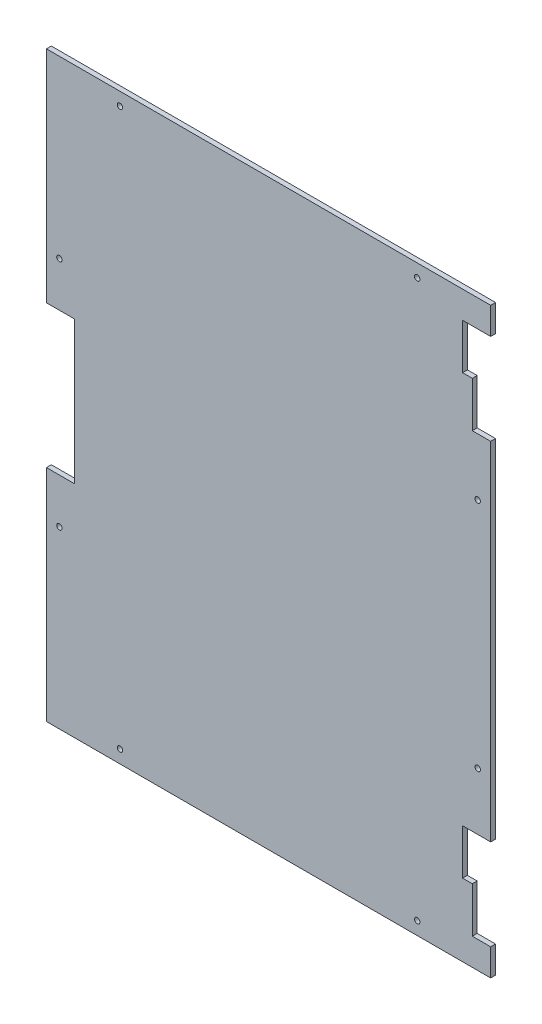
ISO-10303-21;
HEADER;
FILE_DESCRIPTION(('STEP AP214'),'2;1');
FILE_NAME('part.step','',(''),(''),'','','');
FILE_SCHEMA(('AUTOMOTIVE_DESIGN { 1 0 10303 214 1 1 1 1 }'));
ENDSEC;
DATA;
#1=APPLICATION_CONTEXT('core data for automotive mechanical design processes');
#2=APPLICATION_PROTOCOL_DEFINITION('international standard','automotive_design',2000,#1);
#3=PRODUCT_CONTEXT('',#1,'mechanical');
#4=PRODUCT('Part','Part','',(#3));
#5=PRODUCT_RELATED_PRODUCT_CATEGORY('part','',(#4));
#6=PRODUCT_DEFINITION_FORMATION('','',#4);
#7=PRODUCT_DEFINITION_CONTEXT('part definition',#1,'design');
#8=PRODUCT_DEFINITION('design','',#6,#7);
#9=PRODUCT_DEFINITION_SHAPE('','',#8);
#10=(LENGTH_UNIT() NAMED_UNIT(*) SI_UNIT(.MILLI.,.METRE.));
#11=(NAMED_UNIT(*) PLANE_ANGLE_UNIT() SI_UNIT($,.RADIAN.));
#12=(NAMED_UNIT(*) SI_UNIT($,.STERADIAN.) SOLID_ANGLE_UNIT());
#13=UNCERTAINTY_MEASURE_WITH_UNIT(LENGTH_MEASURE(1.E-05),#10,'distance_accuracy_value','');
#14=(GEOMETRIC_REPRESENTATION_CONTEXT(3) GLOBAL_UNCERTAINTY_ASSIGNED_CONTEXT((#13)) GLOBAL_UNIT_ASSIGNED_CONTEXT((#10,
#11,#12)) REPRESENTATION_CONTEXT('',''));
#15=CARTESIAN_POINT('',(0.,0.,0.));
#16=DIRECTION('',(0.,0.,1.));
#17=DIRECTION('',(1.,0.,0.));
#18=AXIS2_PLACEMENT_3D('',#15,#16,#17);
#19=CARTESIAN_POINT('',(0.,0.,4.5));
#20=DIRECTION('',(0.,0.,1.));
#21=DIRECTION('',(1.,0.,0.));
#22=AXIS2_PLACEMENT_3D('',#19,#20,#21);
#23=PLANE('',#22);
#24=CARTESIAN_POINT('',(192.5,107.5,4.5));
#25=DIRECTION('',(0.,0.,1.));
#26=DIRECTION('',(-1.,0.,0.));
#27=AXIS2_PLACEMENT_3D('',#24,#25,#26);
#28=CIRCLE('',#27,2.5);
#29=CARTESIAN_POINT('',(190.,107.5,4.5));
#30=VERTEX_POINT('',#29);
#31=EDGE_CURVE('E661',#30,#30,#28,.T.);
#32=ORIENTED_EDGE('',*,*,#31,.F.);
#33=EDGE_LOOP('',(#32));
#34=FACE_BOUND('',#33,.T.);
#35=CARTESIAN_POINT('',(-194.5,107.5,4.5));
#36=DIRECTION('',(0.,0.,1.));
#37=DIRECTION('',(1.,0.,0.));
#38=AXIS2_PLACEMENT_3D('',#35,#36,#37);
#39=CIRCLE('',#38,2.5);
#40=CARTESIAN_POINT('',(-192.,107.5,4.5));
#41=VERTEX_POINT('',#40);
#42=EDGE_CURVE('E673',#41,#41,#39,.T.);
#43=ORIENTED_EDGE('',*,*,#42,.F.);
#44=EDGE_LOOP('',(#43));
#45=FACE_BOUND('',#44,.T.);
#46=CARTESIAN_POINT('',(-138.5,257.5,4.5));
#47=DIRECTION('',(0.,0.,1.));
#48=DIRECTION('',(1.,0.,0.));
#49=AXIS2_PLACEMENT_3D('',#46,#47,#48);
#50=CIRCLE('',#49,2.5);
#51=CARTESIAN_POINT('',(-136.,257.5,4.5));
#52=VERTEX_POINT('',#51);
#53=EDGE_CURVE('E685',#52,#52,#50,.T.);
#54=ORIENTED_EDGE('',*,*,#53,.F.);
#55=EDGE_LOOP('',(#54));
#56=FACE_BOUND('',#55,.T.);
#57=CARTESIAN_POINT('',(136.5,-257.5,4.5));
#58=DIRECTION('',(0.,0.,1.));
#59=DIRECTION('',(1.,0.,0.));
#60=AXIS2_PLACEMENT_3D('',#57,#58,#59);
#61=CIRCLE('',#60,2.5);
#62=CARTESIAN_POINT('',(139.,-257.5,4.5));
#63=VERTEX_POINT('',#62);
#64=EDGE_CURVE('E208',#63,#63,#61,.T.);
#65=ORIENTED_EDGE('',*,*,#64,.F.);
#66=EDGE_LOOP('',(#65));
#67=FACE_BOUND('',#66,.T.);
#68=DIRECTION('',(0.,-1.,0.));
#69=VECTOR('',#68,1.);
#70=CARTESIAN_POINT('',(-206.5,269.5,4.5));
#71=LINE('',#70,#69);
#72=CARTESIAN_POINT('',(-206.5,269.5,4.5));
#73=VERTEX_POINT('',#72);
#74=CARTESIAN_POINT('',(-206.5,66.,4.5));
#75=VERTEX_POINT('',#74);
#76=EDGE_CURVE('E132',#73,#75,#71,.T.);
#77=ORIENTED_EDGE('',*,*,#76,.T.);
#78=DIRECTION('',(1.,0.,0.));
#79=VECTOR('',#78,1.);
#80=CARTESIAN_POINT('',(-206.5,66.,4.5));
#81=LINE('',#80,#79);
#82=CARTESIAN_POINT('',(-180.5,66.,4.5));
#83=VERTEX_POINT('',#82);
#84=EDGE_CURVE('E353',#75,#83,#81,.T.);
#85=ORIENTED_EDGE('',*,*,#84,.T.);
#86=DIRECTION('',(0.,-1.,0.));
#87=VECTOR('',#86,1.);
#88=CARTESIAN_POINT('',(-180.5,66.,4.5));
#89=LINE('',#88,#87);
#90=CARTESIAN_POINT('',(-180.5,-66.,4.5));
#91=VERTEX_POINT('',#90);
#92=EDGE_CURVE('E297',#83,#91,#89,.T.);
#93=ORIENTED_EDGE('',*,*,#92,.T.);
#94=DIRECTION('',(-1.,0.,0.));
#95=VECTOR('',#94,1.);
#96=CARTESIAN_POINT('',(-206.5,-66.,4.5));
#97=LINE('',#96,#95);
#98=CARTESIAN_POINT('',(-206.5,-66.,4.5));
#99=VERTEX_POINT('',#98);
#100=EDGE_CURVE('E315',#91,#99,#97,.T.);
#101=ORIENTED_EDGE('',*,*,#100,.T.);
#102=DIRECTION('',(0.,-1.,0.));
#103=VECTOR('',#102,1.);
#104=CARTESIAN_POINT('',(-206.5,-66.,4.5));
#105=LINE('',#104,#103);
#106=CARTESIAN_POINT('',(-206.5,-269.5,4.5));
#107=VERTEX_POINT('',#106);
#108=EDGE_CURVE('E312',#99,#107,#105,.T.);
#109=ORIENTED_EDGE('',*,*,#108,.T.);
#110=DIRECTION('',(1.,0.,0.));
#111=VECTOR('',#110,1.);
#112=CARTESIAN_POINT('',(-206.5,-269.5,4.5));
#113=LINE('',#112,#111);
#114=CARTESIAN_POINT('',(204.5,-269.5,4.5));
#115=VERTEX_POINT('',#114);
#116=EDGE_CURVE('E314',#107,#115,#113,.T.);
#117=ORIENTED_EDGE('',*,*,#116,.T.);
#118=DIRECTION('',(0.,1.,0.));
#119=VECTOR('',#118,1.);
#120=CARTESIAN_POINT('',(204.5,-244.5,4.5));
#121=LINE('',#120,#119);
#122=CARTESIAN_POINT('',(204.5,-244.5,4.5));
#123=VERTEX_POINT('',#122);
#124=EDGE_CURVE('E317',#115,#123,#121,.T.);
#125=ORIENTED_EDGE('',*,*,#124,.T.);
#126=DIRECTION('',(-1.,0.,0.));
#127=VECTOR('',#126,1.);
#128=CARTESIAN_POINT('',(187.5,-244.5,4.5));
#129=LINE('',#128,#127);
#130=CARTESIAN_POINT('',(187.5,-244.5,4.5));
#131=VERTEX_POINT('',#130);
#132=EDGE_CURVE('E323',#123,#131,#129,.T.);
#133=ORIENTED_EDGE('',*,*,#132,.T.);
#134=DIRECTION('',(0.,1.,0.));
#135=VECTOR('',#134,1.);
#136=CARTESIAN_POINT('',(187.5,-202.5,4.5));
#137=LINE('',#136,#135);
#138=CARTESIAN_POINT('',(187.5,-202.5,4.5));
#139=VERTEX_POINT('',#138);
#140=EDGE_CURVE('E325',#131,#139,#137,.T.);
#141=ORIENTED_EDGE('',*,*,#140,.T.);
#142=DIRECTION('',(-1.,0.,0.));
#143=VECTOR('',#142,1.);
#144=CARTESIAN_POINT('',(178.5,-202.5,4.5));
#145=LINE('',#144,#143);
#146=CARTESIAN_POINT('',(178.5,-202.5,4.5));
#147=VERTEX_POINT('',#146);
#148=EDGE_CURVE('E327',#139,#147,#145,.T.);
#149=ORIENTED_EDGE('',*,*,#148,.T.);
#150=DIRECTION('',(0.,1.,0.));
#151=VECTOR('',#150,1.);
#152=CARTESIAN_POINT('',(178.5,-160.5,4.5));
#153=LINE('',#152,#151);
#154=CARTESIAN_POINT('',(178.5,-160.5,4.5));
#155=VERTEX_POINT('',#154);
#156=EDGE_CURVE('E329',#147,#155,#153,.T.);
#157=ORIENTED_EDGE('',*,*,#156,.T.);
#158=DIRECTION('',(1.,0.,0.));
#159=VECTOR('',#158,1.);
#160=CARTESIAN_POINT('',(204.5,-160.5,4.5));
#161=LINE('',#160,#159);
#162=CARTESIAN_POINT('',(204.5,-160.5,4.5));
#163=VERTEX_POINT('',#162);
#164=EDGE_CURVE('E331',#155,#163,#161,.T.);
#165=ORIENTED_EDGE('',*,*,#164,.T.);
#166=DIRECTION('',(0.,1.,0.));
#167=VECTOR('',#166,1.);
#168=CARTESIAN_POINT('',(204.5,160.5,4.5));
#169=LINE('',#168,#167);
#170=CARTESIAN_POINT('',(204.5,160.5,4.5));
#171=VERTEX_POINT('',#170);
#172=EDGE_CURVE('E333',#163,#171,#169,.T.);
#173=ORIENTED_EDGE('',*,*,#172,.T.);
#174=DIRECTION('',(-1.,0.,0.));
#175=VECTOR('',#174,1.);
#176=CARTESIAN_POINT('',(204.5,160.5,4.5));
#177=LINE('',#176,#175);
#178=CARTESIAN_POINT('',(187.5,160.5,4.5));
#179=VERTEX_POINT('',#178);
#180=EDGE_CURVE('E335',#171,#179,#177,.T.);
#181=ORIENTED_EDGE('',*,*,#180,.T.);
#182=DIRECTION('',(0.,1.,0.));
#183=VECTOR('',#182,1.);
#184=CARTESIAN_POINT('',(187.5,202.5,4.5));
#185=LINE('',#184,#183);
#186=CARTESIAN_POINT('',(187.5,202.5,4.5));
#187=VERTEX_POINT('',#186);
#188=EDGE_CURVE('E337',#179,#187,#185,.T.);
#189=ORIENTED_EDGE('',*,*,#188,.T.);
#190=DIRECTION('',(-1.,0.,0.));
#191=VECTOR('',#190,1.);
#192=CARTESIAN_POINT('',(178.5,202.5,4.5));
#193=LINE('',#192,#191);
#194=CARTESIAN_POINT('',(178.5,202.5,4.5));
#195=VERTEX_POINT('',#194);
#196=EDGE_CURVE('E339',#187,#195,#193,.T.);
#197=ORIENTED_EDGE('',*,*,#196,.T.);
#198=DIRECTION('',(0.,1.,0.));
#199=VECTOR('',#198,1.);
#200=CARTESIAN_POINT('',(178.5,202.5,4.5));
#201=LINE('',#200,#199);
#202=CARTESIAN_POINT('',(178.5,244.5,4.5));
#203=VERTEX_POINT('',#202);
#204=EDGE_CURVE('E188',#195,#203,#201,.T.);
#205=ORIENTED_EDGE('',*,*,#204,.T.);
#206=DIRECTION('',(1.,0.,0.));
#207=VECTOR('',#206,1.);
#208=CARTESIAN_POINT('',(204.5,244.5,4.5));
#209=LINE('',#208,#207);
#210=CARTESIAN_POINT('',(204.5,244.5,4.5));
#211=VERTEX_POINT('',#210);
#212=EDGE_CURVE('E182',#203,#211,#209,.T.);
#213=ORIENTED_EDGE('',*,*,#212,.T.);
#214=DIRECTION('',(0.,1.,0.));
#215=VECTOR('',#214,1.);
#216=CARTESIAN_POINT('',(204.5,269.5,4.5));
#217=LINE('',#216,#215);
#218=CARTESIAN_POINT('',(204.5,269.5,4.5));
#219=VERTEX_POINT('',#218);
#220=EDGE_CURVE('E186',#211,#219,#217,.T.);
#221=ORIENTED_EDGE('',*,*,#220,.T.);
#222=DIRECTION('',(-1.,0.,0.));
#223=VECTOR('',#222,1.);
#224=CARTESIAN_POINT('',(-206.5,269.5,4.5));
#225=LINE('',#224,#223);
#226=EDGE_CURVE('E54',#219,#73,#225,.T.);
#227=ORIENTED_EDGE('',*,*,#226,.T.);
#228=EDGE_LOOP('',(#77,#85,#93,#101,#109,#117,#125,#133,#141,#149,#157,#165,#173,#181,#189,#197,
#205,#213,#221,#227));
#229=FACE_BOUND('',#228,.T.);
#230=CARTESIAN_POINT('',(-138.5,-257.5,4.5));
#231=DIRECTION('',(0.,0.,1.));
#232=DIRECTION('',(-1.,0.,0.));
#233=AXIS2_PLACEMENT_3D('',#230,#231,#232);
#234=CIRCLE('',#233,2.5);
#235=CARTESIAN_POINT('',(-141.,-257.5,4.5));
#236=VERTEX_POINT('',#235);
#237=EDGE_CURVE('E691',#236,#236,#234,.T.);
#238=ORIENTED_EDGE('',*,*,#237,.F.);
#239=EDGE_LOOP('',(#238));
#240=FACE_BOUND('',#239,.T.);
#241=CARTESIAN_POINT('',(136.5,257.5,4.5));
#242=DIRECTION('',(0.,0.,1.));
#243=DIRECTION('',(-1.,0.,0.));
#244=AXIS2_PLACEMENT_3D('',#241,#242,#243);
#245=CIRCLE('',#244,2.5);
#246=CARTESIAN_POINT('',(134.,257.5,4.5));
#247=VERTEX_POINT('',#246);
#248=EDGE_CURVE('E679',#247,#247,#245,.T.);
#249=ORIENTED_EDGE('',*,*,#248,.F.);
#250=EDGE_LOOP('',(#249));
#251=FACE_BOUND('',#250,.T.);
#252=CARTESIAN_POINT('',(-194.5,-107.5,4.5));
#253=DIRECTION('',(0.,0.,1.));
#254=DIRECTION('',(-1.,0.,0.));
#255=AXIS2_PLACEMENT_3D('',#252,#253,#254);
#256=CIRCLE('',#255,2.49999999999997);
#257=CARTESIAN_POINT('',(-197.,-107.5,4.5));
#258=VERTEX_POINT('',#257);
#259=EDGE_CURVE('E667',#258,#258,#256,.T.);
#260=ORIENTED_EDGE('',*,*,#259,.F.);
#261=EDGE_LOOP('',(#260));
#262=FACE_BOUND('',#261,.T.);
#263=CARTESIAN_POINT('',(192.5,-107.5,4.5));
#264=DIRECTION('',(0.,0.,1.));
#265=DIRECTION('',(1.,0.,0.));
#266=AXIS2_PLACEMENT_3D('',#263,#264,#265);
#267=CIRCLE('',#266,2.49999999999997);
#268=CARTESIAN_POINT('',(195.,-107.5,4.5));
#269=VERTEX_POINT('',#268);
#270=EDGE_CURVE('E652',#269,#269,#267,.T.);
#271=ORIENTED_EDGE('',*,*,#270,.F.);
#272=EDGE_LOOP('',(#271));
#273=FACE_BOUND('',#272,.T.);
#274=ADVANCED_FACE('F37',(#34,#45,#56,#67,#229,#240,#251,#262,#273),#23,.T.);
#275=CARTESIAN_POINT('',(0.,0.,0.));
#276=DIRECTION('',(0.,0.,1.));
#277=DIRECTION('',(1.,0.,0.));
#278=AXIS2_PLACEMENT_3D('',#275,#276,#277);
#279=PLANE('',#278);
#280=DIRECTION('',(0.,-1.,0.));
#281=VECTOR('',#280,1.);
#282=CARTESIAN_POINT('',(-206.5,160.5,0.));
#283=LINE('',#282,#281);
#284=CARTESIAN_POINT('',(-206.5,269.5,0.));
#285=VERTEX_POINT('',#284);
#286=CARTESIAN_POINT('',(-206.5,66.,0.));
#287=VERTEX_POINT('',#286);
#288=EDGE_CURVE('E126',#285,#287,#283,.T.);
#289=ORIENTED_EDGE('',*,*,#288,.F.);
#290=DIRECTION('',(-1.,0.,0.));
#291=VECTOR('',#290,1.);
#292=CARTESIAN_POINT('',(-206.5,269.5,0.));
#293=LINE('',#292,#291);
#294=CARTESIAN_POINT('',(204.5,269.5,0.));
#295=VERTEX_POINT('',#294);
#296=EDGE_CURVE('E243',#295,#285,#293,.T.);
#297=ORIENTED_EDGE('',*,*,#296,.F.);
#298=DIRECTION('',(0.,1.,0.));
#299=VECTOR('',#298,1.);
#300=CARTESIAN_POINT('',(204.5,269.5,0.));
#301=LINE('',#300,#299);
#302=CARTESIAN_POINT('',(204.5,244.5,0.));
#303=VERTEX_POINT('',#302);
#304=EDGE_CURVE('E119',#303,#295,#301,.T.);
#305=ORIENTED_EDGE('',*,*,#304,.F.);
#306=DIRECTION('',(1.,0.,0.));
#307=VECTOR('',#306,1.);
#308=CARTESIAN_POINT('',(204.5,244.5,0.));
#309=LINE('',#308,#307);
#310=CARTESIAN_POINT('',(178.5,244.5,0.));
#311=VERTEX_POINT('',#310);
#312=EDGE_CURVE('E196',#311,#303,#309,.T.);
#313=ORIENTED_EDGE('',*,*,#312,.F.);
#314=DIRECTION('',(0.,1.,0.));
#315=VECTOR('',#314,1.);
#316=CARTESIAN_POINT('',(178.5,202.5,0.));
#317=LINE('',#316,#315);
#318=CARTESIAN_POINT('',(178.5,202.5,0.));
#319=VERTEX_POINT('',#318);
#320=EDGE_CURVE('E239',#319,#311,#317,.T.);
#321=ORIENTED_EDGE('',*,*,#320,.F.);
#322=DIRECTION('',(-1.,0.,0.));
#323=VECTOR('',#322,1.);
#324=CARTESIAN_POINT('',(178.5,202.5,0.));
#325=LINE('',#324,#323);
#326=CARTESIAN_POINT('',(187.5,202.5,0.));
#327=VERTEX_POINT('',#326);
#328=EDGE_CURVE('E237',#327,#319,#325,.T.);
#329=ORIENTED_EDGE('',*,*,#328,.F.);
#330=DIRECTION('',(0.,1.,0.));
#331=VECTOR('',#330,1.);
#332=CARTESIAN_POINT('',(187.5,202.5,0.));
#333=LINE('',#332,#331);
#334=CARTESIAN_POINT('',(187.5,160.5,0.));
#335=VERTEX_POINT('',#334);
#336=EDGE_CURVE('E235',#335,#327,#333,.T.);
#337=ORIENTED_EDGE('',*,*,#336,.F.);
#338=DIRECTION('',(-1.,0.,0.));
#339=VECTOR('',#338,1.);
#340=CARTESIAN_POINT('',(204.5,160.5,0.));
#341=LINE('',#340,#339);
#342=CARTESIAN_POINT('',(204.5,160.5,0.));
#343=VERTEX_POINT('',#342);
#344=EDGE_CURVE('E233',#343,#335,#341,.T.);
#345=ORIENTED_EDGE('',*,*,#344,.F.);
#346=DIRECTION('',(0.,1.,0.));
#347=VECTOR('',#346,1.);
#348=CARTESIAN_POINT('',(204.5,160.5,0.));
#349=LINE('',#348,#347);
#350=CARTESIAN_POINT('',(204.5,-160.5,0.));
#351=VERTEX_POINT('',#350);
#352=EDGE_CURVE('E231',#351,#343,#349,.T.);
#353=ORIENTED_EDGE('',*,*,#352,.F.);
#354=DIRECTION('',(1.,0.,0.));
#355=VECTOR('',#354,1.);
#356=CARTESIAN_POINT('',(204.5,-160.5,0.));
#357=LINE('',#356,#355);
#358=CARTESIAN_POINT('',(178.5,-160.5,0.));
#359=VERTEX_POINT('',#358);
#360=EDGE_CURVE('E229',#359,#351,#357,.T.);
#361=ORIENTED_EDGE('',*,*,#360,.F.);
#362=DIRECTION('',(0.,1.,0.));
#363=VECTOR('',#362,1.);
#364=CARTESIAN_POINT('',(178.5,-160.5,0.));
#365=LINE('',#364,#363);
#366=CARTESIAN_POINT('',(178.5,-202.5,0.));
#367=VERTEX_POINT('',#366);
#368=EDGE_CURVE('E227',#367,#359,#365,.T.);
#369=ORIENTED_EDGE('',*,*,#368,.F.);
#370=DIRECTION('',(-1.,0.,0.));
#371=VECTOR('',#370,1.);
#372=CARTESIAN_POINT('',(178.5,-202.5,0.));
#373=LINE('',#372,#371);
#374=CARTESIAN_POINT('',(187.5,-202.5,0.));
#375=VERTEX_POINT('',#374);
#376=EDGE_CURVE('E225',#375,#367,#373,.T.);
#377=ORIENTED_EDGE('',*,*,#376,.F.);
#378=DIRECTION('',(0.,1.,0.));
#379=VECTOR('',#378,1.);
#380=CARTESIAN_POINT('',(187.5,-202.5,0.));
#381=LINE('',#380,#379);
#382=CARTESIAN_POINT('',(187.5,-244.5,0.));
#383=VERTEX_POINT('',#382);
#384=EDGE_CURVE('E223',#383,#375,#381,.T.);
#385=ORIENTED_EDGE('',*,*,#384,.F.);
#386=DIRECTION('',(-1.,0.,0.));
#387=VECTOR('',#386,1.);
#388=CARTESIAN_POINT('',(187.5,-244.5,0.));
#389=LINE('',#388,#387);
#390=CARTESIAN_POINT('',(204.5,-244.5,0.));
#391=VERTEX_POINT('',#390);
#392=EDGE_CURVE('E221',#391,#383,#389,.T.);
#393=ORIENTED_EDGE('',*,*,#392,.F.);
#394=DIRECTION('',(0.,1.,0.));
#395=VECTOR('',#394,1.);
#396=CARTESIAN_POINT('',(204.5,-244.5,0.));
#397=LINE('',#396,#395);
#398=CARTESIAN_POINT('',(204.5,-269.5,0.));
#399=VERTEX_POINT('',#398);
#400=EDGE_CURVE('E219',#399,#391,#397,.T.);
#401=ORIENTED_EDGE('',*,*,#400,.F.);
#402=DIRECTION('',(1.,0.,0.));
#403=VECTOR('',#402,1.);
#404=CARTESIAN_POINT('',(-206.5,-269.5,0.));
#405=LINE('',#404,#403);
#406=CARTESIAN_POINT('',(-206.5,-269.5,0.));
#407=VERTEX_POINT('',#406);
#408=EDGE_CURVE('E217',#407,#399,#405,.T.);
#409=ORIENTED_EDGE('',*,*,#408,.F.);
#410=DIRECTION('',(0.,-1.,0.));
#411=VECTOR('',#410,1.);
#412=CARTESIAN_POINT('',(-206.5,-244.5,0.));
#413=LINE('',#412,#411);
#414=CARTESIAN_POINT('',(-206.5,-66.,0.));
#415=VERTEX_POINT('',#414);
#416=EDGE_CURVE('E215',#415,#407,#413,.T.);
#417=ORIENTED_EDGE('',*,*,#416,.F.);
#418=DIRECTION('',(-1.,0.,0.));
#419=VECTOR('',#418,1.);
#420=CARTESIAN_POINT('',(-206.5,-66.,0.));
#421=LINE('',#420,#419);
#422=CARTESIAN_POINT('',(-180.5,-66.,0.));
#423=VERTEX_POINT('',#422);
#424=EDGE_CURVE('E212',#423,#415,#421,.T.);
#425=ORIENTED_EDGE('',*,*,#424,.F.);
#426=DIRECTION('',(0.,-1.,0.));
#427=VECTOR('',#426,1.);
#428=CARTESIAN_POINT('',(-180.5,66.,0.));
#429=LINE('',#428,#427);
#430=CARTESIAN_POINT('',(-180.5,66.,0.));
#431=VERTEX_POINT('',#430);
#432=EDGE_CURVE('E210',#431,#423,#429,.T.);
#433=ORIENTED_EDGE('',*,*,#432,.F.);
#434=DIRECTION('',(1.,0.,0.));
#435=VECTOR('',#434,1.);
#436=CARTESIAN_POINT('',(-206.5,66.,0.));
#437=LINE('',#436,#435);
#438=EDGE_CURVE('E207',#287,#431,#437,.T.);
#439=ORIENTED_EDGE('',*,*,#438,.F.);
#440=EDGE_LOOP('',(#289,#297,#305,#313,#321,#329,#337,#345,#353,#361,#369,#377,#385,#393,#401,
#409,#417,#425,#433,#439));
#441=FACE_BOUND('',#440,.T.);
#442=CARTESIAN_POINT('',(136.5,-257.5,0.));
#443=DIRECTION('',(0.,0.,1.));
#444=DIRECTION('',(1.,0.,0.));
#445=AXIS2_PLACEMENT_3D('',#442,#443,#444);
#446=CIRCLE('',#445,2.5);
#447=CARTESIAN_POINT('',(139.,-257.5,0.));
#448=VERTEX_POINT('',#447);
#449=EDGE_CURVE('E357',#448,#448,#446,.T.);
#450=ORIENTED_EDGE('',*,*,#449,.T.);
#451=EDGE_LOOP('',(#450));
#452=FACE_BOUND('',#451,.T.);
#453=CARTESIAN_POINT('',(-138.5,-257.5,0.));
#454=DIRECTION('',(0.,0.,1.));
#455=DIRECTION('',(-1.,0.,0.));
#456=AXIS2_PLACEMENT_3D('',#453,#454,#455);
#457=CIRCLE('',#456,2.5);
#458=CARTESIAN_POINT('',(-141.,-257.5,0.));
#459=VERTEX_POINT('',#458);
#460=EDGE_CURVE('E688',#459,#459,#457,.T.);
#461=ORIENTED_EDGE('',*,*,#460,.T.);
#462=EDGE_LOOP('',(#461));
#463=FACE_BOUND('',#462,.T.);
#464=CARTESIAN_POINT('',(-138.5,257.5,0.));
#465=DIRECTION('',(0.,0.,1.));
#466=DIRECTION('',(1.,0.,0.));
#467=AXIS2_PLACEMENT_3D('',#464,#465,#466);
#468=CIRCLE('',#467,2.5);
#469=CARTESIAN_POINT('',(-136.,257.5,0.));
#470=VERTEX_POINT('',#469);
#471=EDGE_CURVE('E682',#470,#470,#468,.T.);
#472=ORIENTED_EDGE('',*,*,#471,.T.);
#473=EDGE_LOOP('',(#472));
#474=FACE_BOUND('',#473,.T.);
#475=CARTESIAN_POINT('',(136.5,257.5,0.));
#476=DIRECTION('',(0.,0.,1.));
#477=DIRECTION('',(-1.,0.,0.));
#478=AXIS2_PLACEMENT_3D('',#475,#476,#477);
#479=CIRCLE('',#478,2.5);
#480=CARTESIAN_POINT('',(134.,257.5,0.));
#481=VERTEX_POINT('',#480);
#482=EDGE_CURVE('E676',#481,#481,#479,.T.);
#483=ORIENTED_EDGE('',*,*,#482,.T.);
#484=EDGE_LOOP('',(#483));
#485=FACE_BOUND('',#484,.T.);
#486=CARTESIAN_POINT('',(-194.5,107.5,0.));
#487=DIRECTION('',(0.,0.,1.));
#488=DIRECTION('',(1.,0.,0.));
#489=AXIS2_PLACEMENT_3D('',#486,#487,#488);
#490=CIRCLE('',#489,2.5);
#491=CARTESIAN_POINT('',(-192.,107.5,0.));
#492=VERTEX_POINT('',#491);
#493=EDGE_CURVE('E670',#492,#492,#490,.T.);
#494=ORIENTED_EDGE('',*,*,#493,.T.);
#495=EDGE_LOOP('',(#494));
#496=FACE_BOUND('',#495,.T.);
#497=CARTESIAN_POINT('',(-194.5,-107.5,0.));
#498=DIRECTION('',(0.,0.,1.));
#499=DIRECTION('',(-1.,0.,0.));
#500=AXIS2_PLACEMENT_3D('',#497,#498,#499);
#501=CIRCLE('',#500,2.49999999999997);
#502=CARTESIAN_POINT('',(-197.,-107.5,0.));
#503=VERTEX_POINT('',#502);
#504=EDGE_CURVE('E664',#503,#503,#501,.T.);
#505=ORIENTED_EDGE('',*,*,#504,.T.);
#506=EDGE_LOOP('',(#505));
#507=FACE_BOUND('',#506,.T.);
#508=CARTESIAN_POINT('',(192.5,107.5,0.));
#509=DIRECTION('',(0.,0.,1.));
#510=DIRECTION('',(-1.,0.,0.));
#511=AXIS2_PLACEMENT_3D('',#508,#509,#510);
#512=CIRCLE('',#511,2.5);
#513=CARTESIAN_POINT('',(190.,107.5,0.));
#514=VERTEX_POINT('',#513);
#515=EDGE_CURVE('E658',#514,#514,#512,.T.);
#516=ORIENTED_EDGE('',*,*,#515,.T.);
#517=EDGE_LOOP('',(#516));
#518=FACE_BOUND('',#517,.T.);
#519=CARTESIAN_POINT('',(192.5,-107.5,0.));
#520=DIRECTION('',(0.,0.,1.));
#521=DIRECTION('',(1.,0.,0.));
#522=AXIS2_PLACEMENT_3D('',#519,#520,#521);
#523=CIRCLE('',#522,2.49999999999997);
#524=CARTESIAN_POINT('',(195.,-107.5,0.));
#525=VERTEX_POINT('',#524);
#526=EDGE_CURVE('E655',#525,#525,#523,.T.);
#527=ORIENTED_EDGE('',*,*,#526,.T.);
#528=EDGE_LOOP('',(#527));
#529=FACE_BOUND('',#528,.T.);
#530=ADVANCED_FACE('F301',(#441,#452,#463,#474,#485,#496,#507,#518,#529),#279,.F.);
#531=CARTESIAN_POINT('',(-206.5,160.5,4.5));
#532=DIRECTION('',(1.,0.,0.));
#533=DIRECTION('',(0.,1.,0.));
#534=AXIS2_PLACEMENT_3D('',#531,#532,#533);
#535=PLANE('',#534);
#536=ORIENTED_EDGE('',*,*,#288,.T.);
#537=DIRECTION('',(0.,0.,-1.));
#538=VECTOR('',#537,1.);
#539=CARTESIAN_POINT('',(-206.5,66.,4.5));
#540=LINE('',#539,#538);
#541=EDGE_CURVE('E11',#75,#287,#540,.T.);
#542=ORIENTED_EDGE('',*,*,#541,.F.);
#543=ORIENTED_EDGE('',*,*,#76,.F.);
#544=DIRECTION('',(0.,0.,-1.));
#545=VECTOR('',#544,1.);
#546=CARTESIAN_POINT('',(-206.5,269.5,4.5));
#547=LINE('',#546,#545);
#548=EDGE_CURVE('E202',#73,#285,#547,.T.);
#549=ORIENTED_EDGE('',*,*,#548,.T.);
#550=EDGE_LOOP('',(#536,#542,#543,#549));
#551=FACE_BOUND('',#550,.T.);
#552=ADVANCED_FACE('F39',(#551),#535,.F.);
#553=CARTESIAN_POINT('',(-206.5,66.,4.5));
#554=DIRECTION('',(0.,1.,0.));
#555=DIRECTION('',(0.,0.,1.));
#556=AXIS2_PLACEMENT_3D('',#553,#554,#555);
#557=PLANE('',#556);
#558=ORIENTED_EDGE('',*,*,#438,.T.);
#559=DIRECTION('',(0.,0.,-1.));
#560=VECTOR('',#559,1.);
#561=CARTESIAN_POINT('',(-180.5,66.,4.5));
#562=LINE('',#561,#560);
#563=EDGE_CURVE('E46',#83,#431,#562,.T.);
#564=ORIENTED_EDGE('',*,*,#563,.F.);
#565=ORIENTED_EDGE('',*,*,#84,.F.);
#566=ORIENTED_EDGE('',*,*,#541,.T.);
#567=EDGE_LOOP('',(#558,#564,#565,#566));
#568=FACE_BOUND('',#567,.T.);
#569=ADVANCED_FACE('F359',(#568),#557,.F.);
#570=CARTESIAN_POINT('',(-180.5,66.,4.5));
#571=DIRECTION('',(1.,0.,0.));
#572=DIRECTION('',(0.,1.,0.));
#573=AXIS2_PLACEMENT_3D('',#570,#571,#572);
#574=PLANE('',#573);
#575=ORIENTED_EDGE('',*,*,#432,.T.);
#576=DIRECTION('',(0.,0.,-1.));
#577=VECTOR('',#576,1.);
#578=CARTESIAN_POINT('',(-180.5,-66.,4.5));
#579=LINE('',#578,#577);
#580=EDGE_CURVE('E288',#91,#423,#579,.T.);
#581=ORIENTED_EDGE('',*,*,#580,.F.);
#582=ORIENTED_EDGE('',*,*,#92,.F.);
#583=ORIENTED_EDGE('',*,*,#563,.T.);
#584=EDGE_LOOP('',(#575,#581,#582,#583));
#585=FACE_BOUND('',#584,.T.);
#586=ADVANCED_FACE('F295',(#585),#574,.F.);
#587=CARTESIAN_POINT('',(-206.5,-66.,4.5));
#588=DIRECTION('',(0.,-1.,0.));
#589=DIRECTION('',(0.,0.,-1.));
#590=AXIS2_PLACEMENT_3D('',#587,#588,#589);
#591=PLANE('',#590);
#592=ORIENTED_EDGE('',*,*,#424,.T.);
#593=DIRECTION('',(0.,0.,-1.));
#594=VECTOR('',#593,1.);
#595=CARTESIAN_POINT('',(-206.5,-66.,4.5));
#596=LINE('',#595,#594);
#597=EDGE_CURVE('E285',#99,#415,#596,.T.);
#598=ORIENTED_EDGE('',*,*,#597,.F.);
#599=ORIENTED_EDGE('',*,*,#100,.F.);
#600=ORIENTED_EDGE('',*,*,#580,.T.);
#601=EDGE_LOOP('',(#592,#598,#599,#600));
#602=FACE_BOUND('',#601,.T.);
#603=ADVANCED_FACE('F306',(#602),#591,.F.);
#604=CARTESIAN_POINT('',(-206.5,-244.5,4.5));
#605=DIRECTION('',(1.,0.,0.));
#606=DIRECTION('',(0.,1.,0.));
#607=AXIS2_PLACEMENT_3D('',#604,#605,#606);
#608=PLANE('',#607);
#609=ORIENTED_EDGE('',*,*,#416,.T.);
#610=DIRECTION('',(0.,0.,-1.));
#611=VECTOR('',#610,1.);
#612=CARTESIAN_POINT('',(-206.5,-269.5,4.5));
#613=LINE('',#612,#611);
#614=EDGE_CURVE('E282',#107,#407,#613,.T.);
#615=ORIENTED_EDGE('',*,*,#614,.F.);
#616=ORIENTED_EDGE('',*,*,#108,.F.);
#617=ORIENTED_EDGE('',*,*,#597,.T.);
#618=EDGE_LOOP('',(#609,#615,#616,#617));
#619=FACE_BOUND('',#618,.T.);
#620=ADVANCED_FACE('F310',(#619),#608,.F.);
#621=CARTESIAN_POINT('',(-206.5,-269.5,4.5));
#622=DIRECTION('',(0.,1.,0.));
#623=DIRECTION('',(-1.,0.,0.));
#624=AXIS2_PLACEMENT_3D('',#621,#622,#623);
#625=PLANE('',#624);
#626=ORIENTED_EDGE('',*,*,#408,.T.);
#627=DIRECTION('',(0.,0.,-1.));
#628=VECTOR('',#627,1.);
#629=CARTESIAN_POINT('',(204.5,-269.5,4.5));
#630=LINE('',#629,#628);
#631=EDGE_CURVE('E279',#115,#399,#630,.T.);
#632=ORIENTED_EDGE('',*,*,#631,.F.);
#633=ORIENTED_EDGE('',*,*,#116,.F.);
#634=ORIENTED_EDGE('',*,*,#614,.T.);
#635=EDGE_LOOP('',(#626,#632,#633,#634));
#636=FACE_BOUND('',#635,.T.);
#637=ADVANCED_FACE('F424',(#636),#625,.F.);
#638=CARTESIAN_POINT('',(204.5,-244.5,4.5));
#639=DIRECTION('',(-1.,0.,0.));
#640=DIRECTION('',(0.,-1.,0.));
#641=AXIS2_PLACEMENT_3D('',#638,#639,#640);
#642=PLANE('',#641);
#643=ORIENTED_EDGE('',*,*,#400,.T.);
#644=DIRECTION('',(0.,0.,-1.));
#645=VECTOR('',#644,1.);
#646=CARTESIAN_POINT('',(204.5,-244.5,4.5));
#647=LINE('',#646,#645);
#648=EDGE_CURVE('E276',#123,#391,#647,.T.);
#649=ORIENTED_EDGE('',*,*,#648,.F.);
#650=ORIENTED_EDGE('',*,*,#124,.F.);
#651=ORIENTED_EDGE('',*,*,#631,.T.);
#652=EDGE_LOOP('',(#643,#649,#650,#651));
#653=FACE_BOUND('',#652,.T.);
#654=ADVANCED_FACE('F420',(#653),#642,.F.);
#655=CARTESIAN_POINT('',(187.5,-244.5,4.5));
#656=DIRECTION('',(0.,-1.,0.));
#657=DIRECTION('',(1.,0.,0.));
#658=AXIS2_PLACEMENT_3D('',#655,#656,#657);
#659=PLANE('',#658);
#660=ORIENTED_EDGE('',*,*,#392,.T.);
#661=DIRECTION('',(0.,0.,-1.));
#662=VECTOR('',#661,1.);
#663=CARTESIAN_POINT('',(187.5,-244.5,4.5));
#664=LINE('',#663,#662);
#665=EDGE_CURVE('E273',#131,#383,#664,.T.);
#666=ORIENTED_EDGE('',*,*,#665,.F.);
#667=ORIENTED_EDGE('',*,*,#132,.F.);
#668=ORIENTED_EDGE('',*,*,#648,.T.);
#669=EDGE_LOOP('',(#660,#666,#667,#668));
#670=FACE_BOUND('',#669,.T.);
#671=ADVANCED_FACE('F416',(#670),#659,.F.);
#672=CARTESIAN_POINT('',(187.5,-202.5,4.5));
#673=DIRECTION('',(-1.,0.,0.));
#674=DIRECTION('',(0.,0.,1.));
#675=AXIS2_PLACEMENT_3D('',#672,#673,#674);
#676=PLANE('',#675);
#677=ORIENTED_EDGE('',*,*,#384,.T.);
#678=DIRECTION('',(0.,0.,-1.));
#679=VECTOR('',#678,1.);
#680=CARTESIAN_POINT('',(187.5,-202.5,4.5));
#681=LINE('',#680,#679);
#682=EDGE_CURVE('E270',#139,#375,#681,.T.);
#683=ORIENTED_EDGE('',*,*,#682,.F.);
#684=ORIENTED_EDGE('',*,*,#140,.F.);
#685=ORIENTED_EDGE('',*,*,#665,.T.);
#686=EDGE_LOOP('',(#677,#683,#684,#685));
#687=FACE_BOUND('',#686,.T.);
#688=ADVANCED_FACE('F412',(#687),#676,.F.);
#689=CARTESIAN_POINT('',(178.5,-202.5,4.5));
#690=DIRECTION('',(0.,-1.,0.));
#691=DIRECTION('',(0.,0.,-1.));
#692=AXIS2_PLACEMENT_3D('',#689,#690,#691);
#693=PLANE('',#692);
#694=ORIENTED_EDGE('',*,*,#376,.T.);
#695=DIRECTION('',(0.,0.,-1.));
#696=VECTOR('',#695,1.);
#697=CARTESIAN_POINT('',(178.5,-202.5,4.5));
#698=LINE('',#697,#696);
#699=EDGE_CURVE('E267',#147,#367,#698,.T.);
#700=ORIENTED_EDGE('',*,*,#699,.F.);
#701=ORIENTED_EDGE('',*,*,#148,.F.);
#702=ORIENTED_EDGE('',*,*,#682,.T.);
#703=EDGE_LOOP('',(#694,#700,#701,#702));
#704=FACE_BOUND('',#703,.T.);
#705=ADVANCED_FACE('F408',(#704),#693,.F.);
#706=CARTESIAN_POINT('',(178.5,-160.5,4.5));
#707=DIRECTION('',(-1.,0.,0.));
#708=DIRECTION('',(0.,-1.,0.));
#709=AXIS2_PLACEMENT_3D('',#706,#707,#708);
#710=PLANE('',#709);
#711=ORIENTED_EDGE('',*,*,#368,.T.);
#712=DIRECTION('',(0.,0.,-1.));
#713=VECTOR('',#712,1.);
#714=CARTESIAN_POINT('',(178.5,-160.5,4.5));
#715=LINE('',#714,#713);
#716=EDGE_CURVE('E264',#155,#359,#715,.T.);
#717=ORIENTED_EDGE('',*,*,#716,.F.);
#718=ORIENTED_EDGE('',*,*,#156,.F.);
#719=ORIENTED_EDGE('',*,*,#699,.T.);
#720=EDGE_LOOP('',(#711,#717,#718,#719));
#721=FACE_BOUND('',#720,.T.);
#722=ADVANCED_FACE('F404',(#721),#710,.F.);
#723=CARTESIAN_POINT('',(204.5,-160.5,4.5));
#724=DIRECTION('',(0.,1.,0.));
#725=DIRECTION('',(-1.,0.,0.));
#726=AXIS2_PLACEMENT_3D('',#723,#724,#725);
#727=PLANE('',#726);
#728=ORIENTED_EDGE('',*,*,#360,.T.);
#729=DIRECTION('',(0.,0.,-1.));
#730=VECTOR('',#729,1.);
#731=CARTESIAN_POINT('',(204.5,-160.5,4.5));
#732=LINE('',#731,#730);
#733=EDGE_CURVE('E261',#163,#351,#732,.T.);
#734=ORIENTED_EDGE('',*,*,#733,.F.);
#735=ORIENTED_EDGE('',*,*,#164,.F.);
#736=ORIENTED_EDGE('',*,*,#716,.T.);
#737=EDGE_LOOP('',(#728,#734,#735,#736));
#738=FACE_BOUND('',#737,.T.);
#739=ADVANCED_FACE('F400',(#738),#727,.F.);
#740=CARTESIAN_POINT('',(204.5,160.5,4.5));
#741=DIRECTION('',(-1.,0.,0.));
#742=DIRECTION('',(0.,-1.,0.));
#743=AXIS2_PLACEMENT_3D('',#740,#741,#742);
#744=PLANE('',#743);
#745=ORIENTED_EDGE('',*,*,#352,.T.);
#746=DIRECTION('',(0.,0.,-1.));
#747=VECTOR('',#746,1.);
#748=CARTESIAN_POINT('',(204.5,160.5,4.5));
#749=LINE('',#748,#747);
#750=EDGE_CURVE('E258',#171,#343,#749,.T.);
#751=ORIENTED_EDGE('',*,*,#750,.F.);
#752=ORIENTED_EDGE('',*,*,#172,.F.);
#753=ORIENTED_EDGE('',*,*,#733,.T.);
#754=EDGE_LOOP('',(#745,#751,#752,#753));
#755=FACE_BOUND('',#754,.T.);
#756=ADVANCED_FACE('F396',(#755),#744,.F.);
#757=CARTESIAN_POINT('',(204.5,160.5,4.5));
#758=DIRECTION('',(0.,-1.,0.));
#759=DIRECTION('',(0.,0.,-1.));
#760=AXIS2_PLACEMENT_3D('',#757,#758,#759);
#761=PLANE('',#760);
#762=ORIENTED_EDGE('',*,*,#344,.T.);
#763=DIRECTION('',(0.,0.,-1.));
#764=VECTOR('',#763,1.);
#765=CARTESIAN_POINT('',(187.5,160.5,4.5));
#766=LINE('',#765,#764);
#767=EDGE_CURVE('E255',#179,#335,#766,.T.);
#768=ORIENTED_EDGE('',*,*,#767,.F.);
#769=ORIENTED_EDGE('',*,*,#180,.F.);
#770=ORIENTED_EDGE('',*,*,#750,.T.);
#771=EDGE_LOOP('',(#762,#768,#769,#770));
#772=FACE_BOUND('',#771,.T.);
#773=ADVANCED_FACE('F392',(#772),#761,.F.);
#774=CARTESIAN_POINT('',(187.5,202.5,4.5));
#775=DIRECTION('',(-1.,0.,0.));
#776=DIRECTION('',(0.,0.,1.));
#777=AXIS2_PLACEMENT_3D('',#774,#775,#776);
#778=PLANE('',#777);
#779=ORIENTED_EDGE('',*,*,#336,.T.);
#780=DIRECTION('',(0.,0.,-1.));
#781=VECTOR('',#780,1.);
#782=CARTESIAN_POINT('',(187.5,202.5,4.5));
#783=LINE('',#782,#781);
#784=EDGE_CURVE('E252',#187,#327,#783,.T.);
#785=ORIENTED_EDGE('',*,*,#784,.F.);
#786=ORIENTED_EDGE('',*,*,#188,.F.);
#787=ORIENTED_EDGE('',*,*,#767,.T.);
#788=EDGE_LOOP('',(#779,#785,#786,#787));
#789=FACE_BOUND('',#788,.T.);
#790=ADVANCED_FACE('F389',(#789),#778,.F.);
#791=CARTESIAN_POINT('',(178.5,202.5,4.5));
#792=DIRECTION('',(0.,-1.,0.));
#793=DIRECTION('',(0.,0.,-1.));
#794=AXIS2_PLACEMENT_3D('',#791,#792,#793);
#795=PLANE('',#794);
#796=ORIENTED_EDGE('',*,*,#328,.T.);
#797=DIRECTION('',(0.,0.,-1.));
#798=VECTOR('',#797,1.);
#799=CARTESIAN_POINT('',(178.5,202.5,4.5));
#800=LINE('',#799,#798);
#801=EDGE_CURVE('E249',#195,#319,#800,.T.);
#802=ORIENTED_EDGE('',*,*,#801,.F.);
#803=ORIENTED_EDGE('',*,*,#196,.F.);
#804=ORIENTED_EDGE('',*,*,#784,.T.);
#805=EDGE_LOOP('',(#796,#802,#803,#804));
#806=FACE_BOUND('',#805,.T.);
#807=ADVANCED_FACE('F345',(#806),#795,.F.);
#808=CARTESIAN_POINT('',(178.5,202.5,4.5));
#809=DIRECTION('',(-1.,0.,0.));
#810=DIRECTION('',(0.,0.,1.));
#811=AXIS2_PLACEMENT_3D('',#808,#809,#810);
#812=PLANE('',#811);
#813=ORIENTED_EDGE('',*,*,#320,.T.);
#814=DIRECTION('',(0.,0.,-1.));
#815=VECTOR('',#814,1.);
#816=CARTESIAN_POINT('',(178.5,244.5,4.5));
#817=LINE('',#816,#815);
#818=EDGE_CURVE('E197',#203,#311,#817,.T.);
#819=ORIENTED_EDGE('',*,*,#818,.F.);
#820=ORIENTED_EDGE('',*,*,#204,.F.);
#821=ORIENTED_EDGE('',*,*,#801,.T.);
#822=EDGE_LOOP('',(#813,#819,#820,#821));
#823=FACE_BOUND('',#822,.T.);
#824=ADVANCED_FACE('F349',(#823),#812,.F.);
#825=CARTESIAN_POINT('',(204.5,244.5,4.5));
#826=DIRECTION('',(0.,1.,0.));
#827=DIRECTION('',(-1.,0.,0.));
#828=AXIS2_PLACEMENT_3D('',#825,#826,#827);
#829=PLANE('',#828);
#830=ORIENTED_EDGE('',*,*,#312,.T.);
#831=DIRECTION('',(0.,0.,-1.));
#832=VECTOR('',#831,1.);
#833=CARTESIAN_POINT('',(204.5,244.5,4.5));
#834=LINE('',#833,#832);
#835=EDGE_CURVE('E193',#211,#303,#834,.T.);
#836=ORIENTED_EDGE('',*,*,#835,.F.);
#837=ORIENTED_EDGE('',*,*,#212,.F.);
#838=ORIENTED_EDGE('',*,*,#818,.T.);
#839=EDGE_LOOP('',(#830,#836,#837,#838));
#840=FACE_BOUND('',#839,.T.);
#841=ADVANCED_FACE('F194',(#840),#829,.F.);
#842=CARTESIAN_POINT('',(204.5,269.5,4.5));
#843=DIRECTION('',(-1.,0.,0.));
#844=DIRECTION('',(0.,0.,1.));
#845=AXIS2_PLACEMENT_3D('',#842,#843,#844);
#846=PLANE('',#845);
#847=ORIENTED_EDGE('',*,*,#304,.T.);
#848=DIRECTION('',(0.,0.,-1.));
#849=VECTOR('',#848,1.);
#850=CARTESIAN_POINT('',(204.5,269.5,4.5));
#851=LINE('',#850,#849);
#852=EDGE_CURVE('E198',#219,#295,#851,.T.);
#853=ORIENTED_EDGE('',*,*,#852,.F.);
#854=ORIENTED_EDGE('',*,*,#220,.F.);
#855=ORIENTED_EDGE('',*,*,#835,.T.);
#856=EDGE_LOOP('',(#847,#853,#854,#855));
#857=FACE_BOUND('',#856,.T.);
#858=ADVANCED_FACE('F200',(#857),#846,.F.);
#859=CARTESIAN_POINT('',(-206.5,269.5,4.5));
#860=DIRECTION('',(0.,-1.,0.));
#861=DIRECTION('',(1.,0.,0.));
#862=AXIS2_PLACEMENT_3D('',#859,#860,#861);
#863=PLANE('',#862);
#864=ORIENTED_EDGE('',*,*,#296,.T.);
#865=ORIENTED_EDGE('',*,*,#548,.F.);
#866=ORIENTED_EDGE('',*,*,#226,.F.);
#867=ORIENTED_EDGE('',*,*,#852,.T.);
#868=EDGE_LOOP('',(#864,#865,#866,#867));
#869=FACE_BOUND('',#868,.T.);
#870=ADVANCED_FACE('F351',(#869),#863,.F.);
#871=CARTESIAN_POINT('',(136.5,-257.5,4.5));
#872=DIRECTION('',(0.,0.,-1.));
#873=DIRECTION('',(-1.,0.,0.));
#874=AXIS2_PLACEMENT_3D('',#871,#872,#873);
#875=CYLINDRICAL_SURFACE('',#874,2.5);
#876=ORIENTED_EDGE('',*,*,#64,.T.);
#877=EDGE_LOOP('',(#876));
#878=FACE_BOUND('',#877,.T.);
#879=ORIENTED_EDGE('',*,*,#449,.F.);
#880=EDGE_LOOP('',(#879));
#881=FACE_BOUND('',#880,.T.);
#882=ADVANCED_FACE('F376',(#878,#881),#875,.F.);
#883=CARTESIAN_POINT('',(-138.5,-257.5,4.5));
#884=DIRECTION('',(0.,0.,-1.));
#885=DIRECTION('',(-1.,0.,0.));
#886=AXIS2_PLACEMENT_3D('',#883,#884,#885);
#887=CYLINDRICAL_SURFACE('',#886,2.5);
#888=ORIENTED_EDGE('',*,*,#237,.T.);
#889=EDGE_LOOP('',(#888));
#890=FACE_BOUND('',#889,.T.);
#891=ORIENTED_EDGE('',*,*,#460,.F.);
#892=EDGE_LOOP('',(#891));
#893=FACE_BOUND('',#892,.T.);
#894=ADVANCED_FACE('F506',(#890,#893),#887,.F.);
#895=CARTESIAN_POINT('',(-138.5,257.5,4.5));
#896=DIRECTION('',(0.,0.,-1.));
#897=DIRECTION('',(-1.,0.,0.));
#898=AXIS2_PLACEMENT_3D('',#895,#896,#897);
#899=CYLINDRICAL_SURFACE('',#898,2.5);
#900=ORIENTED_EDGE('',*,*,#53,.T.);
#901=EDGE_LOOP('',(#900));
#902=FACE_BOUND('',#901,.T.);
#903=ORIENTED_EDGE('',*,*,#471,.F.);
#904=EDGE_LOOP('',(#903));
#905=FACE_BOUND('',#904,.T.);
#906=ADVANCED_FACE('F513',(#902,#905),#899,.F.);
#907=CARTESIAN_POINT('',(136.5,257.5,4.5));
#908=DIRECTION('',(0.,0.,-1.));
#909=DIRECTION('',(-1.,0.,0.));
#910=AXIS2_PLACEMENT_3D('',#907,#908,#909);
#911=CYLINDRICAL_SURFACE('',#910,2.5);
#912=ORIENTED_EDGE('',*,*,#248,.T.);
#913=EDGE_LOOP('',(#912));
#914=FACE_BOUND('',#913,.T.);
#915=ORIENTED_EDGE('',*,*,#482,.F.);
#916=EDGE_LOOP('',(#915));
#917=FACE_BOUND('',#916,.T.);
#918=ADVANCED_FACE('F520',(#914,#917),#911,.F.);
#919=CARTESIAN_POINT('',(-194.5,107.5,4.5));
#920=DIRECTION('',(0.,0.,-1.));
#921=DIRECTION('',(-1.,0.,0.));
#922=AXIS2_PLACEMENT_3D('',#919,#920,#921);
#923=CYLINDRICAL_SURFACE('',#922,2.5);
#924=ORIENTED_EDGE('',*,*,#42,.T.);
#925=EDGE_LOOP('',(#924));
#926=FACE_BOUND('',#925,.T.);
#927=ORIENTED_EDGE('',*,*,#493,.F.);
#928=EDGE_LOOP('',(#927));
#929=FACE_BOUND('',#928,.T.);
#930=ADVANCED_FACE('F528',(#926,#929),#923,.F.);
#931=CARTESIAN_POINT('',(-194.5,-107.5,4.5));
#932=DIRECTION('',(0.,0.,-1.));
#933=DIRECTION('',(-1.,0.,0.));
#934=AXIS2_PLACEMENT_3D('',#931,#932,#933);
#935=CYLINDRICAL_SURFACE('',#934,2.49999999999997);
#936=ORIENTED_EDGE('',*,*,#259,.T.);
#937=EDGE_LOOP('',(#936));
#938=FACE_BOUND('',#937,.T.);
#939=ORIENTED_EDGE('',*,*,#504,.F.);
#940=EDGE_LOOP('',(#939));
#941=FACE_BOUND('',#940,.T.);
#942=ADVANCED_FACE('F536',(#938,#941),#935,.F.);
#943=CARTESIAN_POINT('',(192.5,107.5,4.5));
#944=DIRECTION('',(0.,0.,-1.));
#945=DIRECTION('',(-1.,0.,0.));
#946=AXIS2_PLACEMENT_3D('',#943,#944,#945);
#947=CYLINDRICAL_SURFACE('',#946,2.5);
#948=ORIENTED_EDGE('',*,*,#31,.T.);
#949=EDGE_LOOP('',(#948));
#950=FACE_BOUND('',#949,.T.);
#951=ORIENTED_EDGE('',*,*,#515,.F.);
#952=EDGE_LOOP('',(#951));
#953=FACE_BOUND('',#952,.T.);
#954=ADVANCED_FACE('F544',(#950,#953),#947,.F.);
#955=CARTESIAN_POINT('',(192.5,-107.5,4.5));
#956=DIRECTION('',(0.,0.,-1.));
#957=DIRECTION('',(-1.,0.,0.));
#958=AXIS2_PLACEMENT_3D('',#955,#956,#957);
#959=CYLINDRICAL_SURFACE('',#958,2.49999999999997);
#960=ORIENTED_EDGE('',*,*,#270,.T.);
#961=EDGE_LOOP('',(#960));
#962=FACE_BOUND('',#961,.T.);
#963=ORIENTED_EDGE('',*,*,#526,.F.);
#964=EDGE_LOOP('',(#963));
#965=FACE_BOUND('',#964,.T.);
#966=ADVANCED_FACE('F552',(#962,#965),#959,.F.);
#967=CLOSED_SHELL('',(#274,#530,#552,#569,#586,#603,#620,#637,#654,#671,#688,#705,#722,#739,
#756,#773,#790,#807,#824,#841,#858,#870,#882,#894,#906,#918,#930,#942,#954,#966));
#968=MANIFOLD_SOLID_BREP('B2',#967);
#969=ADVANCED_BREP_SHAPE_REPRESENTATION('',(#18,#968),#14);
#970=SHAPE_DEFINITION_REPRESENTATION(#9,#969);
ENDSEC;
END-ISO-10303-21;
